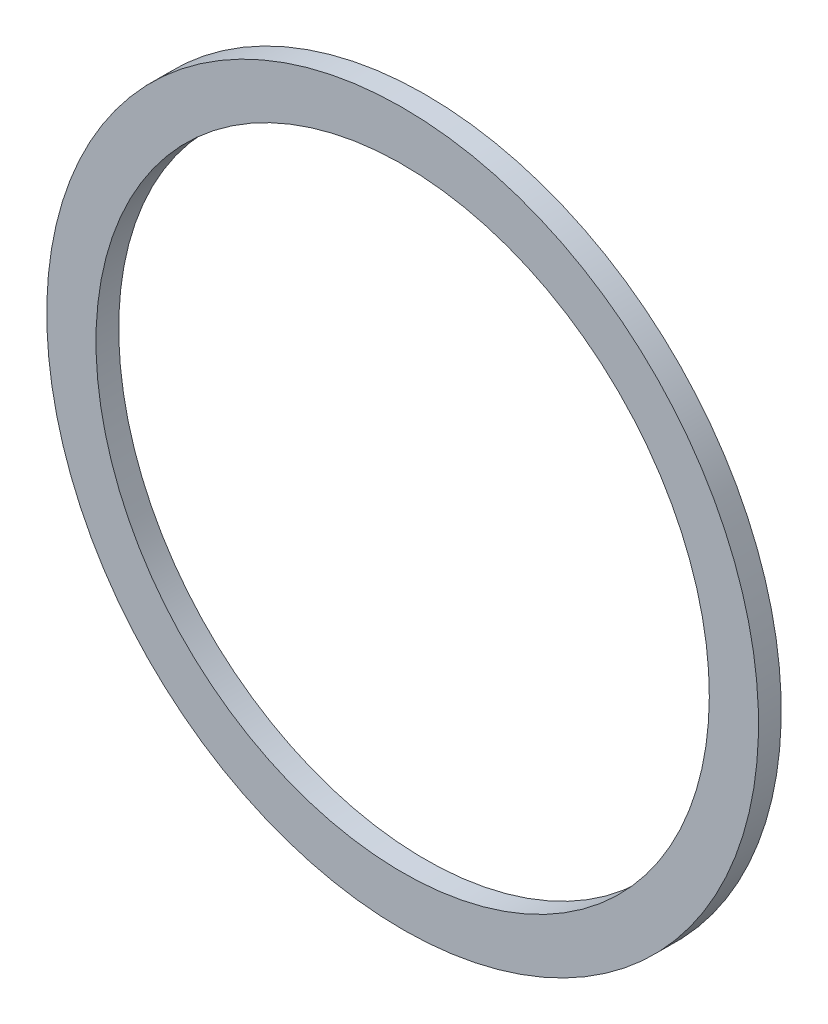
ISO-10303-21;
HEADER;
FILE_DESCRIPTION(('STEP AP214'),'2;1');
FILE_NAME('part.step','',(''),(''),'','','');
FILE_SCHEMA(('AUTOMOTIVE_DESIGN { 1 0 10303 214 1 1 1 1 }'));
ENDSEC;
DATA;
#1=APPLICATION_CONTEXT('core data for automotive mechanical design processes');
#2=APPLICATION_PROTOCOL_DEFINITION('international standard','automotive_design',2000,#1);
#3=PRODUCT_CONTEXT('',#1,'mechanical');
#4=PRODUCT('Part','Part','',(#3));
#5=PRODUCT_RELATED_PRODUCT_CATEGORY('part','',(#4));
#6=PRODUCT_DEFINITION_FORMATION('','',#4);
#7=PRODUCT_DEFINITION_CONTEXT('part definition',#1,'design');
#8=PRODUCT_DEFINITION('design','',#6,#7);
#9=PRODUCT_DEFINITION_SHAPE('','',#8);
#10=(LENGTH_UNIT() NAMED_UNIT(*) SI_UNIT(.MILLI.,.METRE.));
#11=(NAMED_UNIT(*) PLANE_ANGLE_UNIT() SI_UNIT($,.RADIAN.));
#12=(NAMED_UNIT(*) SI_UNIT($,.STERADIAN.) SOLID_ANGLE_UNIT());
#13=UNCERTAINTY_MEASURE_WITH_UNIT(LENGTH_MEASURE(1.E-05),#10,'distance_accuracy_value','');
#14=(GEOMETRIC_REPRESENTATION_CONTEXT(3) GLOBAL_UNCERTAINTY_ASSIGNED_CONTEXT((#13)) GLOBAL_UNIT_ASSIGNED_CONTEXT((#10,
#11,#12)) REPRESENTATION_CONTEXT('',''));
#15=CARTESIAN_POINT('',(0.,0.,0.));
#16=DIRECTION('',(0.,0.,1.));
#17=DIRECTION('',(1.,0.,0.));
#18=AXIS2_PLACEMENT_3D('',#15,#16,#17);
#19=CARTESIAN_POINT('',(0.,0.,5.75));
#20=DIRECTION('',(0.,0.,-1.));
#21=DIRECTION('',(-0.994579553820323,-0.103978416618872,0.));
#22=AXIS2_PLACEMENT_3D('',#19,#20,#21);
#23=CYLINDRICAL_SURFACE('',#22,10.125);
#24=CARTESIAN_POINT('',(0.,0.,5.75));
#25=DIRECTION('',(0.,0.,-1.));
#26=DIRECTION('',(-0.994579553820323,-0.103978416618872,0.));
#27=AXIS2_PLACEMENT_3D('',#24,#25,#26);
#28=CIRCLE('',#27,10.125);
#29=CARTESIAN_POINT('',(-10.0701179824308,-1.05278146826608,5.75));
#30=VERTEX_POINT('',#29);
#31=EDGE_CURVE('E11',#30,#30,#28,.T.);
#32=ORIENTED_EDGE('',*,*,#31,.F.);
#33=EDGE_LOOP('',(#32));
#34=FACE_BOUND('',#33,.T.);
#35=CARTESIAN_POINT('',(0.,0.,5.));
#36=DIRECTION('',(0.,0.,1.));
#37=DIRECTION('',(-0.994579553820323,-0.103978416618872,0.));
#38=AXIS2_PLACEMENT_3D('',#35,#36,#37);
#39=CIRCLE('',#38,10.125);
#40=CARTESIAN_POINT('',(-10.0701179824308,-1.05278146826608,5.));
#41=VERTEX_POINT('',#40);
#42=EDGE_CURVE('E53',#41,#41,#39,.T.);
#43=ORIENTED_EDGE('',*,*,#42,.F.);
#44=EDGE_LOOP('',(#43));
#45=FACE_BOUND('',#44,.T.);
#46=ADVANCED_FACE('F16',(#34,#45),#23,.F.);
#47=CARTESIAN_POINT('',(0.,0.,5.75));
#48=DIRECTION('',(0.,0.,-1.));
#49=DIRECTION('',(-0.994579553820323,-0.103978416618872,0.));
#50=AXIS2_PLACEMENT_3D('',#47,#48,#49);
#51=CYLINDRICAL_SURFACE('',#50,11.75);
#52=CARTESIAN_POINT('',(0.,0.,5.75));
#53=DIRECTION('',(0.,0.,1.));
#54=DIRECTION('',(-0.994579553820323,-0.103978416618872,0.));
#55=AXIS2_PLACEMENT_3D('',#52,#53,#54);
#56=CIRCLE('',#55,11.75);
#57=CARTESIAN_POINT('',(-11.6863097573888,-1.22174639527175,5.75));
#58=VERTEX_POINT('',#57);
#59=EDGE_CURVE('E24',#58,#58,#56,.T.);
#60=ORIENTED_EDGE('',*,*,#59,.F.);
#61=EDGE_LOOP('',(#60));
#62=FACE_BOUND('',#61,.T.);
#63=CARTESIAN_POINT('',(0.,0.,5.));
#64=DIRECTION('',(0.,0.,1.));
#65=DIRECTION('',(-0.994579553820323,-0.103978416618872,0.));
#66=AXIS2_PLACEMENT_3D('',#63,#64,#65);
#67=CIRCLE('',#66,11.75);
#68=CARTESIAN_POINT('',(-11.6863097573888,-1.22174639527175,5.));
#69=VERTEX_POINT('',#68);
#70=EDGE_CURVE('E49',#69,#69,#67,.T.);
#71=ORIENTED_EDGE('',*,*,#70,.T.);
#72=EDGE_LOOP('',(#71));
#73=FACE_BOUND('',#72,.T.);
#74=ADVANCED_FACE('F50',(#62,#73),#51,.T.);
#75=CARTESIAN_POINT('',(0.,0.,5.75));
#76=DIRECTION('',(0.,0.,1.));
#77=DIRECTION('',(1.,0.,0.));
#78=AXIS2_PLACEMENT_3D('',#75,#76,#77);
#79=PLANE('',#78);
#80=ORIENTED_EDGE('',*,*,#31,.T.);
#81=EDGE_LOOP('',(#80));
#82=FACE_BOUND('',#81,.T.);
#83=ORIENTED_EDGE('',*,*,#59,.T.);
#84=EDGE_LOOP('',(#83));
#85=FACE_BOUND('',#84,.T.);
#86=ADVANCED_FACE('F81',(#82,#85),#79,.T.);
#87=CARTESIAN_POINT('',(0.,0.,5.));
#88=DIRECTION('',(0.,0.,1.));
#89=DIRECTION('',(1.,0.,0.));
#90=AXIS2_PLACEMENT_3D('',#87,#88,#89);
#91=PLANE('',#90);
#92=ORIENTED_EDGE('',*,*,#42,.T.);
#93=EDGE_LOOP('',(#92));
#94=FACE_BOUND('',#93,.T.);
#95=ORIENTED_EDGE('',*,*,#70,.F.);
#96=EDGE_LOOP('',(#95));
#97=FACE_BOUND('',#96,.T.);
#98=ADVANCED_FACE('F76',(#94,#97),#91,.F.);
#99=CLOSED_SHELL('',(#46,#74,#86,#98));
#100=MANIFOLD_SOLID_BREP('B1',#99);
#101=ADVANCED_BREP_SHAPE_REPRESENTATION('',(#18,#100),#14);
#102=SHAPE_DEFINITION_REPRESENTATION(#9,#101);
ENDSEC;
END-ISO-10303-21;
